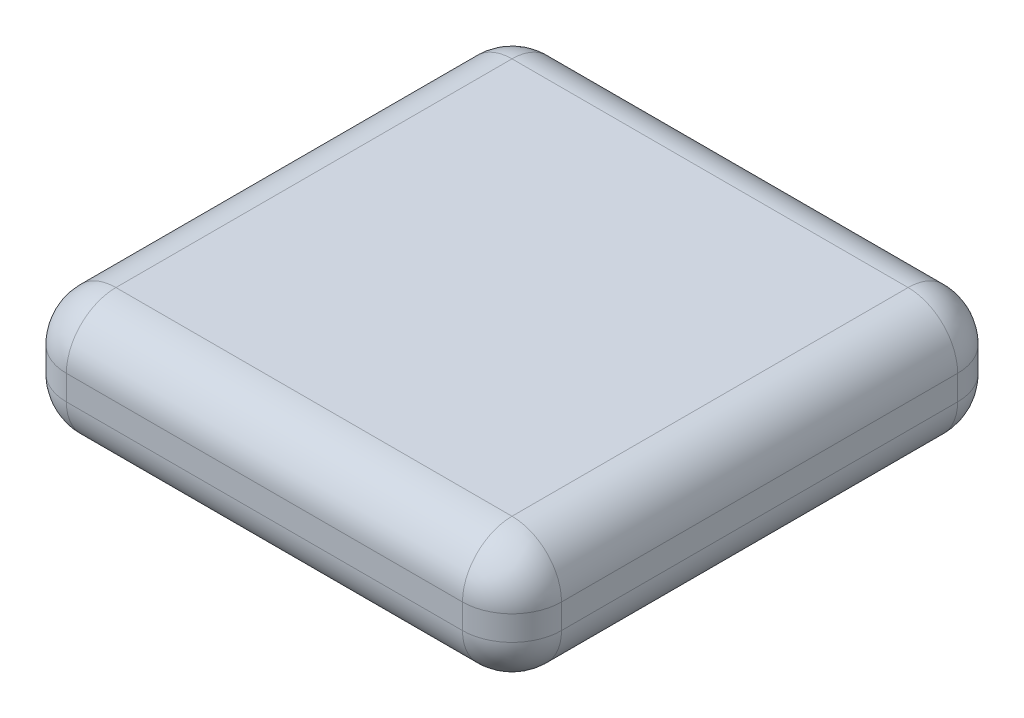
ISO-10303-21;
HEADER;
FILE_DESCRIPTION(('STEP AP214'),'2;1');
FILE_NAME('part.step','',(''),(''),'','','');
FILE_SCHEMA(('AUTOMOTIVE_DESIGN { 1 0 10303 214 1 1 1 1 }'));
ENDSEC;
DATA;
#1=APPLICATION_CONTEXT('core data for automotive mechanical design processes');
#2=APPLICATION_PROTOCOL_DEFINITION('international standard','automotive_design',2000,#1);
#3=PRODUCT_CONTEXT('',#1,'mechanical');
#4=PRODUCT('Part','Part','',(#3));
#5=PRODUCT_RELATED_PRODUCT_CATEGORY('part','',(#4));
#6=PRODUCT_DEFINITION_FORMATION('','',#4);
#7=PRODUCT_DEFINITION_CONTEXT('part definition',#1,'design');
#8=PRODUCT_DEFINITION('design','',#6,#7);
#9=PRODUCT_DEFINITION_SHAPE('','',#8);
#10=(LENGTH_UNIT() NAMED_UNIT(*) SI_UNIT(.MILLI.,.METRE.));
#11=(NAMED_UNIT(*) PLANE_ANGLE_UNIT() SI_UNIT($,.RADIAN.));
#12=(NAMED_UNIT(*) SI_UNIT($,.STERADIAN.) SOLID_ANGLE_UNIT());
#13=UNCERTAINTY_MEASURE_WITH_UNIT(LENGTH_MEASURE(1.E-05),#10,'distance_accuracy_value','');
#14=(GEOMETRIC_REPRESENTATION_CONTEXT(3) GLOBAL_UNCERTAINTY_ASSIGNED_CONTEXT((#13)) GLOBAL_UNIT_ASSIGNED_CONTEXT((#10,
#11,#12)) REPRESENTATION_CONTEXT('',''));
#15=CARTESIAN_POINT('',(0.,0.,0.));
#16=DIRECTION('',(0.,0.,1.));
#17=DIRECTION('',(1.,0.,0.));
#18=AXIS2_PLACEMENT_3D('',#15,#16,#17);
#19=CARTESIAN_POINT('',(100.,50.,-100.));
#20=DIRECTION('',(-1.,0.,0.));
#21=DIRECTION('',(0.,0.,1.));
#22=AXIS2_PLACEMENT_3D('',#19,#20,#21);
#23=PLANE('',#22);
#24=DIRECTION('',(0.,-1.,0.));
#25=VECTOR('',#24,1.);
#26=CARTESIAN_POINT('',(100.,50.,80.));
#27=LINE('',#26,#25);
#28=CARTESIAN_POINT('',(100.,30.,80.));
#29=VERTEX_POINT('',#28);
#30=CARTESIAN_POINT('',(100.,20.,80.));
#31=VERTEX_POINT('',#30);
#32=EDGE_CURVE('E178',#29,#31,#27,.T.);
#33=ORIENTED_EDGE('',*,*,#32,.T.);
#34=DIRECTION('',(0.,0.,-1.));
#35=VECTOR('',#34,1.);
#36=CARTESIAN_POINT('',(100.,20.,-100.));
#37=LINE('',#36,#35);
#38=CARTESIAN_POINT('',(100.,20.,-80.));
#39=VERTEX_POINT('',#38);
#40=EDGE_CURVE('E185',#31,#39,#37,.T.);
#41=ORIENTED_EDGE('',*,*,#40,.T.);
#42=DIRECTION('',(0.,-1.,0.));
#43=VECTOR('',#42,1.);
#44=CARTESIAN_POINT('',(100.,50.,-80.));
#45=LINE('',#44,#43);
#46=CARTESIAN_POINT('',(100.,30.,-80.));
#47=VERTEX_POINT('',#46);
#48=EDGE_CURVE('E181',#39,#47,#45,.F.);
#49=ORIENTED_EDGE('',*,*,#48,.T.);
#50=DIRECTION('',(0.,0.,-1.));
#51=VECTOR('',#50,1.);
#52=CARTESIAN_POINT('',(100.,30.,100.));
#53=LINE('',#52,#51);
#54=EDGE_CURVE('E175',#47,#29,#53,.F.);
#55=ORIENTED_EDGE('',*,*,#54,.T.);
#56=EDGE_LOOP('',(#33,#41,#49,#55));
#57=FACE_BOUND('',#56,.T.);
#58=ADVANCED_FACE('F39',(#57),#23,.F.);
#59=CARTESIAN_POINT('',(-100.,50.,-100.));
#60=DIRECTION('',(0.,0.,1.));
#61=DIRECTION('',(1.,0.,0.));
#62=AXIS2_PLACEMENT_3D('',#59,#60,#61);
#63=PLANE('',#62);
#64=DIRECTION('',(0.,-1.,0.));
#65=VECTOR('',#64,1.);
#66=CARTESIAN_POINT('',(80.,50.,-100.));
#67=LINE('',#66,#65);
#68=CARTESIAN_POINT('',(80.,30.,-100.));
#69=VERTEX_POINT('',#68);
#70=CARTESIAN_POINT('',(80.,20.,-100.));
#71=VERTEX_POINT('',#70);
#72=EDGE_CURVE('E142',#69,#71,#67,.T.);
#73=ORIENTED_EDGE('',*,*,#72,.T.);
#74=DIRECTION('',(-1.,0.,0.));
#75=VECTOR('',#74,1.);
#76=CARTESIAN_POINT('',(-100.,20.,-100.));
#77=LINE('',#76,#75);
#78=CARTESIAN_POINT('',(-80.,20.,-100.));
#79=VERTEX_POINT('',#78);
#80=EDGE_CURVE('E137',#71,#79,#77,.T.);
#81=ORIENTED_EDGE('',*,*,#80,.T.);
#82=DIRECTION('',(0.,-1.,0.));
#83=VECTOR('',#82,1.);
#84=CARTESIAN_POINT('',(-80.,50.,-100.));
#85=LINE('',#84,#83);
#86=CARTESIAN_POINT('',(-80.,30.,-100.));
#87=VERTEX_POINT('',#86);
#88=EDGE_CURVE('E130',#79,#87,#85,.F.);
#89=ORIENTED_EDGE('',*,*,#88,.T.);
#90=DIRECTION('',(-1.,0.,0.));
#91=VECTOR('',#90,1.);
#92=CARTESIAN_POINT('',(100.,30.,-100.));
#93=LINE('',#92,#91);
#94=EDGE_CURVE('E134',#87,#69,#93,.F.);
#95=ORIENTED_EDGE('',*,*,#94,.T.);
#96=EDGE_LOOP('',(#73,#81,#89,#95));
#97=FACE_BOUND('',#96,.T.);
#98=ADVANCED_FACE('F133',(#97),#63,.F.);
#99=CARTESIAN_POINT('',(-100.,50.,-100.));
#100=DIRECTION('',(1.,0.,0.));
#101=DIRECTION('',(0.,0.,-1.));
#102=AXIS2_PLACEMENT_3D('',#99,#100,#101);
#103=PLANE('',#102);
#104=DIRECTION('',(0.,0.,1.));
#105=VECTOR('',#104,1.);
#106=CARTESIAN_POINT('',(-100.,20.,-100.));
#107=LINE('',#106,#105);
#108=CARTESIAN_POINT('',(-100.,20.,-80.));
#109=VERTEX_POINT('',#108);
#110=CARTESIAN_POINT('',(-99.9999999999999,20.,80.));
#111=VERTEX_POINT('',#110);
#112=EDGE_CURVE('E206',#109,#111,#107,.T.);
#113=ORIENTED_EDGE('',*,*,#112,.T.);
#114=DIRECTION('',(0.,-1.,0.));
#115=VECTOR('',#114,1.);
#116=CARTESIAN_POINT('',(-99.9999999999999,50.,80.));
#117=LINE('',#116,#115);
#118=CARTESIAN_POINT('',(-99.9999999999999,30.,80.));
#119=VERTEX_POINT('',#118);
#120=EDGE_CURVE('E209',#111,#119,#117,.F.);
#121=ORIENTED_EDGE('',*,*,#120,.T.);
#122=DIRECTION('',(0.,0.,1.));
#123=VECTOR('',#122,1.);
#124=CARTESIAN_POINT('',(-100.,30.,-100.));
#125=LINE('',#124,#123);
#126=CARTESIAN_POINT('',(-100.,30.,-80.));
#127=VERTEX_POINT('',#126);
#128=EDGE_CURVE('E201',#119,#127,#125,.F.);
#129=ORIENTED_EDGE('',*,*,#128,.T.);
#130=DIRECTION('',(0.,-1.,0.));
#131=VECTOR('',#130,1.);
#132=CARTESIAN_POINT('',(-100.,50.,-80.));
#133=LINE('',#132,#131);
#134=EDGE_CURVE('E148',#127,#109,#133,.T.);
#135=ORIENTED_EDGE('',*,*,#134,.T.);
#136=EDGE_LOOP('',(#113,#121,#129,#135));
#137=FACE_BOUND('',#136,.T.);
#138=ADVANCED_FACE('F349',(#137),#103,.F.);
#139=CARTESIAN_POINT('',(-99.9999999999999,50.,100.));
#140=DIRECTION('',(0.,0.,-1.));
#141=DIRECTION('',(-1.,0.,0.));
#142=AXIS2_PLACEMENT_3D('',#139,#140,#141);
#143=PLANE('',#142);
#144=DIRECTION('',(0.,-1.,0.));
#145=VECTOR('',#144,1.);
#146=CARTESIAN_POINT('',(-79.9999999999999,50.,100.));
#147=LINE('',#146,#145);
#148=CARTESIAN_POINT('',(-79.9999999999999,30.,100.));
#149=VERTEX_POINT('',#148);
#150=CARTESIAN_POINT('',(-79.9999999999999,20.,100.));
#151=VERTEX_POINT('',#150);
#152=EDGE_CURVE('E191',#149,#151,#147,.T.);
#153=ORIENTED_EDGE('',*,*,#152,.T.);
#154=DIRECTION('',(1.,0.,0.));
#155=VECTOR('',#154,1.);
#156=CARTESIAN_POINT('',(-99.9999999999999,20.,100.));
#157=LINE('',#156,#155);
#158=CARTESIAN_POINT('',(80.,20.,100.));
#159=VERTEX_POINT('',#158);
#160=EDGE_CURVE('E198',#151,#159,#157,.T.);
#161=ORIENTED_EDGE('',*,*,#160,.T.);
#162=DIRECTION('',(0.,-1.,0.));
#163=VECTOR('',#162,1.);
#164=CARTESIAN_POINT('',(80.,50.,100.));
#165=LINE('',#164,#163);
#166=CARTESIAN_POINT('',(80.,30.,100.));
#167=VERTEX_POINT('',#166);
#168=EDGE_CURVE('E194',#159,#167,#165,.F.);
#169=ORIENTED_EDGE('',*,*,#168,.T.);
#170=DIRECTION('',(1.,0.,0.));
#171=VECTOR('',#170,1.);
#172=CARTESIAN_POINT('',(-99.9999999999999,30.,100.));
#173=LINE('',#172,#171);
#174=EDGE_CURVE('E188',#167,#149,#173,.F.);
#175=ORIENTED_EDGE('',*,*,#174,.T.);
#176=EDGE_LOOP('',(#153,#161,#169,#175));
#177=FACE_BOUND('',#176,.T.);
#178=ADVANCED_FACE('F327',(#177),#143,.F.);
#179=CARTESIAN_POINT('',(0.,50.,0.));
#180=DIRECTION('',(0.,1.,0.));
#181=DIRECTION('',(0.,0.,1.));
#182=AXIS2_PLACEMENT_3D('',#179,#180,#181);
#183=PLANE('',#182);
#184=DIRECTION('',(0.,0.,-1.));
#185=VECTOR('',#184,1.);
#186=CARTESIAN_POINT('',(80.,50.,-100.));
#187=LINE('',#186,#185);
#188=CARTESIAN_POINT('',(80.,50.,80.));
#189=VERTEX_POINT('',#188);
#190=CARTESIAN_POINT('',(80.,50.,-80.));
#191=VERTEX_POINT('',#190);
#192=EDGE_CURVE('E49',#189,#191,#187,.T.);
#193=ORIENTED_EDGE('',*,*,#192,.T.);
#194=DIRECTION('',(-1.,0.,0.));
#195=VECTOR('',#194,1.);
#196=CARTESIAN_POINT('',(-100.,50.,-80.));
#197=LINE('',#196,#195);
#198=CARTESIAN_POINT('',(-80.,50.,-80.));
#199=VERTEX_POINT('',#198);
#200=EDGE_CURVE('E11',#191,#199,#197,.T.);
#201=ORIENTED_EDGE('',*,*,#200,.T.);
#202=DIRECTION('',(0.,0.,1.));
#203=VECTOR('',#202,1.);
#204=CARTESIAN_POINT('',(-79.9999999999999,50.,100.));
#205=LINE('',#204,#203);
#206=CARTESIAN_POINT('',(-79.9999999999999,50.,80.));
#207=VERTEX_POINT('',#206);
#208=EDGE_CURVE('E229',#199,#207,#205,.T.);
#209=ORIENTED_EDGE('',*,*,#208,.T.);
#210=DIRECTION('',(1.,0.,0.));
#211=VECTOR('',#210,1.);
#212=CARTESIAN_POINT('',(100.,50.,80.));
#213=LINE('',#212,#211);
#214=EDGE_CURVE('E226',#207,#189,#213,.T.);
#215=ORIENTED_EDGE('',*,*,#214,.T.);
#216=EDGE_LOOP('',(#193,#201,#209,#215));
#217=FACE_BOUND('',#216,.T.);
#218=ADVANCED_FACE('F356',(#217),#183,.T.);
#219=CARTESIAN_POINT('',(0.,0.,0.));
#220=DIRECTION('',(0.,1.,0.));
#221=DIRECTION('',(0.,0.,1.));
#222=AXIS2_PLACEMENT_3D('',#219,#220,#221);
#223=PLANE('',#222);
#224=DIRECTION('',(1.,0.,0.));
#225=VECTOR('',#224,1.);
#226=CARTESIAN_POINT('',(0.,0.,80.));
#227=LINE('',#226,#225);
#228=CARTESIAN_POINT('',(80.,0.,80.));
#229=VERTEX_POINT('',#228);
#230=CARTESIAN_POINT('',(-79.9999999999999,0.,80.));
#231=VERTEX_POINT('',#230);
#232=EDGE_CURVE('E213',#229,#231,#227,.F.);
#233=ORIENTED_EDGE('',*,*,#232,.T.);
#234=DIRECTION('',(0.,0.,1.));
#235=VECTOR('',#234,1.);
#236=CARTESIAN_POINT('',(-80.,0.,0.));
#237=LINE('',#236,#235);
#238=CARTESIAN_POINT('',(-80.,0.,-80.));
#239=VERTEX_POINT('',#238);
#240=EDGE_CURVE('E222',#231,#239,#237,.F.);
#241=ORIENTED_EDGE('',*,*,#240,.T.);
#242=DIRECTION('',(-1.,0.,0.));
#243=VECTOR('',#242,1.);
#244=CARTESIAN_POINT('',(0.,0.,-80.));
#245=LINE('',#244,#243);
#246=CARTESIAN_POINT('',(80.,0.,-80.));
#247=VERTEX_POINT('',#246);
#248=EDGE_CURVE('E219',#239,#247,#245,.F.);
#249=ORIENTED_EDGE('',*,*,#248,.T.);
#250=DIRECTION('',(0.,0.,-1.));
#251=VECTOR('',#250,1.);
#252=CARTESIAN_POINT('',(80.,0.,0.));
#253=LINE('',#252,#251);
#254=EDGE_CURVE('E216',#247,#229,#253,.F.);
#255=ORIENTED_EDGE('',*,*,#254,.T.);
#256=EDGE_LOOP('',(#233,#241,#249,#255));
#257=FACE_BOUND('',#256,.T.);
#258=ADVANCED_FACE('F319',(#257),#223,.F.);
#259=CARTESIAN_POINT('',(-79.9999999999999,50.,80.));
#260=DIRECTION('',(0.,-1.,0.));
#261=DIRECTION('',(0.,0.,-1.));
#262=AXIS2_PLACEMENT_3D('',#259,#260,#261);
#263=CYLINDRICAL_SURFACE('',#262,20.);
#264=CARTESIAN_POINT('',(-79.9999999999999,30.,80.));
#265=DIRECTION('',(0.,1.,0.));
#266=DIRECTION('',(0.,0.,1.));
#267=AXIS2_PLACEMENT_3D('',#264,#265,#266);
#268=CIRCLE('',#267,20.);
#269=EDGE_CURVE('E43',#119,#149,#268,.T.);
#270=ORIENTED_EDGE('',*,*,#269,.F.);
#271=ORIENTED_EDGE('',*,*,#120,.F.);
#272=CARTESIAN_POINT('',(-79.9999999999999,20.,80.));
#273=DIRECTION('',(0.,-1.,0.));
#274=DIRECTION('',(0.,0.,-1.));
#275=AXIS2_PLACEMENT_3D('',#272,#273,#274);
#276=CIRCLE('',#275,20.);
#277=EDGE_CURVE('E169',#151,#111,#276,.T.);
#278=ORIENTED_EDGE('',*,*,#277,.F.);
#279=ORIENTED_EDGE('',*,*,#152,.F.);
#280=EDGE_LOOP('',(#270,#271,#278,#279));
#281=FACE_BOUND('',#280,.T.);
#282=ADVANCED_FACE('F41',(#281),#263,.T.);
#283=CARTESIAN_POINT('',(-79.9999999999999,30.,80.));
#284=DIRECTION('',(0.,0.,1.));
#285=DIRECTION('',(1.,0.,0.));
#286=AXIS2_PLACEMENT_3D('',#283,#284,#285);
#287=SPHERICAL_SURFACE('',#286,20.);
#288=CARTESIAN_POINT('',(-79.9999999999999,30.,80.));
#289=DIRECTION('',(0.,0.,1.));
#290=DIRECTION('',(1.,0.,0.));
#291=AXIS2_PLACEMENT_3D('',#288,#289,#290);
#292=CIRCLE('',#291,20.);
#293=EDGE_CURVE('E295',#119,#207,#292,.F.);
#294=ORIENTED_EDGE('',*,*,#293,.F.);
#295=ORIENTED_EDGE('',*,*,#269,.T.);
#296=CARTESIAN_POINT('',(-79.9999999999999,30.,80.));
#297=DIRECTION('',(-1.,0.,0.));
#298=DIRECTION('',(0.,-1.,0.));
#299=AXIS2_PLACEMENT_3D('',#296,#297,#298);
#300=CIRCLE('',#299,20.);
#301=EDGE_CURVE('E299',#207,#149,#300,.F.);
#302=ORIENTED_EDGE('',*,*,#301,.F.);
#303=EDGE_LOOP('',(#294,#295,#302));
#304=FACE_BOUND('',#303,.T.);
#305=ADVANCED_FACE('F345',(#304),#287,.T.);
#306=CARTESIAN_POINT('',(-79.9999999999999,20.,80.));
#307=DIRECTION('',(0.,0.,1.));
#308=DIRECTION('',(1.,0.,0.));
#309=AXIS2_PLACEMENT_3D('',#306,#307,#308);
#310=SPHERICAL_SURFACE('',#309,20.);
#311=CARTESIAN_POINT('',(-79.9999999999999,20.,80.));
#312=DIRECTION('',(-1.,0.,0.));
#313=DIRECTION('',(0.,0.,1.));
#314=AXIS2_PLACEMENT_3D('',#311,#312,#313);
#315=CIRCLE('',#314,20.);
#316=EDGE_CURVE('E287',#151,#231,#315,.F.);
#317=ORIENTED_EDGE('',*,*,#316,.F.);
#318=ORIENTED_EDGE('',*,*,#277,.T.);
#319=CARTESIAN_POINT('',(-79.9999999999999,20.,80.));
#320=DIRECTION('',(0.,0.,1.));
#321=DIRECTION('',(1.,0.,0.));
#322=AXIS2_PLACEMENT_3D('',#319,#320,#321);
#323=CIRCLE('',#322,20.);
#324=EDGE_CURVE('E291',#231,#111,#323,.F.);
#325=ORIENTED_EDGE('',*,*,#324,.F.);
#326=EDGE_LOOP('',(#317,#318,#325));
#327=FACE_BOUND('',#326,.T.);
#328=ADVANCED_FACE('F308',(#327),#310,.T.);
#329=CARTESIAN_POINT('',(0.,30.,80.));
#330=DIRECTION('',(-1.,0.,0.));
#331=DIRECTION('',(0.,0.,1.));
#332=AXIS2_PLACEMENT_3D('',#329,#330,#331);
#333=CYLINDRICAL_SURFACE('',#332,20.);
#334=ORIENTED_EDGE('',*,*,#301,.T.);
#335=ORIENTED_EDGE('',*,*,#174,.F.);
#336=CARTESIAN_POINT('',(80.,30.,80.));
#337=DIRECTION('',(1.,0.,0.));
#338=DIRECTION('',(0.,0.,-1.));
#339=AXIS2_PLACEMENT_3D('',#336,#337,#338);
#340=CIRCLE('',#339,20.);
#341=EDGE_CURVE('E280',#189,#167,#340,.T.);
#342=ORIENTED_EDGE('',*,*,#341,.F.);
#343=ORIENTED_EDGE('',*,*,#214,.F.);
#344=EDGE_LOOP('',(#334,#335,#342,#343));
#345=FACE_BOUND('',#344,.T.);
#346=ADVANCED_FACE('F339',(#345),#333,.T.);
#347=CARTESIAN_POINT('',(-80.,30.,0.));
#348=DIRECTION('',(0.,0.,-1.));
#349=DIRECTION('',(-1.,0.,0.));
#350=AXIS2_PLACEMENT_3D('',#347,#348,#349);
#351=CYLINDRICAL_SURFACE('',#350,20.);
#352=ORIENTED_EDGE('',*,*,#293,.T.);
#353=ORIENTED_EDGE('',*,*,#208,.F.);
#354=CARTESIAN_POINT('',(-80.,30.,-80.));
#355=DIRECTION('',(0.,0.,-1.));
#356=DIRECTION('',(-1.,0.,0.));
#357=AXIS2_PLACEMENT_3D('',#354,#355,#356);
#358=CIRCLE('',#357,20.);
#359=EDGE_CURVE('E152',#127,#199,#358,.T.);
#360=ORIENTED_EDGE('',*,*,#359,.F.);
#361=ORIENTED_EDGE('',*,*,#128,.F.);
#362=EDGE_LOOP('',(#352,#353,#360,#361));
#363=FACE_BOUND('',#362,.T.);
#364=ADVANCED_FACE('F347',(#363),#351,.T.);
#365=CARTESIAN_POINT('',(-80.,50.,-80.));
#366=DIRECTION('',(0.,-1.,0.));
#367=DIRECTION('',(0.,0.,-1.));
#368=AXIS2_PLACEMENT_3D('',#365,#366,#367);
#369=CYLINDRICAL_SURFACE('',#368,20.);
#370=CARTESIAN_POINT('',(-80.,20.,-80.));
#371=DIRECTION('',(0.,-1.,0.));
#372=DIRECTION('',(0.,0.,-1.));
#373=AXIS2_PLACEMENT_3D('',#370,#371,#372);
#374=CIRCLE('',#373,20.);
#375=EDGE_CURVE('E153',#109,#79,#374,.T.);
#376=ORIENTED_EDGE('',*,*,#375,.F.);
#377=ORIENTED_EDGE('',*,*,#134,.F.);
#378=CARTESIAN_POINT('',(-80.,30.,-80.));
#379=DIRECTION('',(0.,1.,0.));
#380=DIRECTION('',(0.,0.,1.));
#381=AXIS2_PLACEMENT_3D('',#378,#379,#380);
#382=CIRCLE('',#381,20.);
#383=EDGE_CURVE('E146',#87,#127,#382,.T.);
#384=ORIENTED_EDGE('',*,*,#383,.F.);
#385=ORIENTED_EDGE('',*,*,#88,.F.);
#386=EDGE_LOOP('',(#376,#377,#384,#385));
#387=FACE_BOUND('',#386,.T.);
#388=ADVANCED_FACE('F147',(#387),#369,.T.);
#389=CARTESIAN_POINT('',(-80.,20.,-100.));
#390=DIRECTION('',(0.,0.,1.));
#391=DIRECTION('',(1.,0.,0.));
#392=AXIS2_PLACEMENT_3D('',#389,#390,#391);
#393=CYLINDRICAL_SURFACE('',#392,20.);
#394=ORIENTED_EDGE('',*,*,#324,.T.);
#395=ORIENTED_EDGE('',*,*,#112,.F.);
#396=CARTESIAN_POINT('',(-80.,20.,-80.));
#397=DIRECTION('',(0.,0.,-1.));
#398=DIRECTION('',(-1.,0.,0.));
#399=AXIS2_PLACEMENT_3D('',#396,#397,#398);
#400=CIRCLE('',#399,20.);
#401=EDGE_CURVE('E272',#239,#109,#400,.T.);
#402=ORIENTED_EDGE('',*,*,#401,.F.);
#403=ORIENTED_EDGE('',*,*,#240,.F.);
#404=EDGE_LOOP('',(#394,#395,#402,#403));
#405=FACE_BOUND('',#404,.T.);
#406=ADVANCED_FACE('F316',(#405),#393,.T.);
#407=CARTESIAN_POINT('',(-99.9999999999999,20.,80.));
#408=DIRECTION('',(1.,0.,0.));
#409=DIRECTION('',(0.,0.,-1.));
#410=AXIS2_PLACEMENT_3D('',#407,#408,#409);
#411=CYLINDRICAL_SURFACE('',#410,20.);
#412=ORIENTED_EDGE('',*,*,#316,.T.);
#413=ORIENTED_EDGE('',*,*,#232,.F.);
#414=CARTESIAN_POINT('',(80.,20.,80.));
#415=DIRECTION('',(1.,0.,0.));
#416=DIRECTION('',(0.,0.,-1.));
#417=AXIS2_PLACEMENT_3D('',#414,#415,#416);
#418=CIRCLE('',#417,20.);
#419=EDGE_CURVE('E268',#159,#229,#418,.T.);
#420=ORIENTED_EDGE('',*,*,#419,.F.);
#421=ORIENTED_EDGE('',*,*,#160,.F.);
#422=EDGE_LOOP('',(#412,#413,#420,#421));
#423=FACE_BOUND('',#422,.T.);
#424=ADVANCED_FACE('F324',(#423),#411,.T.);
#425=CARTESIAN_POINT('',(80.,50.,80.));
#426=DIRECTION('',(0.,-1.,0.));
#427=DIRECTION('',(0.,0.,-1.));
#428=AXIS2_PLACEMENT_3D('',#425,#426,#427);
#429=CYLINDRICAL_SURFACE('',#428,20.);
#430=CARTESIAN_POINT('',(80.,30.,80.));
#431=DIRECTION('',(0.,1.,0.));
#432=DIRECTION('',(0.,0.,1.));
#433=AXIS2_PLACEMENT_3D('',#430,#431,#432);
#434=CIRCLE('',#433,20.);
#435=EDGE_CURVE('E283',#167,#29,#434,.T.);
#436=ORIENTED_EDGE('',*,*,#435,.F.);
#437=ORIENTED_EDGE('',*,*,#168,.F.);
#438=CARTESIAN_POINT('',(80.,20.,80.));
#439=DIRECTION('',(0.,-1.,0.));
#440=DIRECTION('',(0.,0.,-1.));
#441=AXIS2_PLACEMENT_3D('',#438,#439,#440);
#442=CIRCLE('',#441,20.);
#443=EDGE_CURVE('E264',#31,#159,#442,.T.);
#444=ORIENTED_EDGE('',*,*,#443,.F.);
#445=ORIENTED_EDGE('',*,*,#32,.F.);
#446=EDGE_LOOP('',(#436,#437,#444,#445));
#447=FACE_BOUND('',#446,.T.);
#448=ADVANCED_FACE('F331',(#447),#429,.T.);
#449=CARTESIAN_POINT('',(80.,30.,80.));
#450=DIRECTION('',(0.,0.,1.));
#451=DIRECTION('',(1.,0.,0.));
#452=AXIS2_PLACEMENT_3D('',#449,#450,#451);
#453=SPHERICAL_SURFACE('',#452,20.);
#454=ORIENTED_EDGE('',*,*,#341,.T.);
#455=ORIENTED_EDGE('',*,*,#435,.T.);
#456=CARTESIAN_POINT('',(80.,30.,80.));
#457=DIRECTION('',(0.,0.,1.));
#458=DIRECTION('',(1.,0.,0.));
#459=AXIS2_PLACEMENT_3D('',#456,#457,#458);
#460=CIRCLE('',#459,20.);
#461=EDGE_CURVE('E158',#189,#29,#460,.F.);
#462=ORIENTED_EDGE('',*,*,#461,.F.);
#463=EDGE_LOOP('',(#454,#455,#462));
#464=FACE_BOUND('',#463,.T.);
#465=ADVANCED_FACE('F401',(#464),#453,.T.);
#466=CARTESIAN_POINT('',(-80.,30.,-80.));
#467=DIRECTION('',(0.,0.,1.));
#468=DIRECTION('',(1.,0.,0.));
#469=AXIS2_PLACEMENT_3D('',#466,#467,#468);
#470=SPHERICAL_SURFACE('',#469,20.);
#471=ORIENTED_EDGE('',*,*,#383,.T.);
#472=ORIENTED_EDGE('',*,*,#359,.T.);
#473=CARTESIAN_POINT('',(-80.,30.,-80.));
#474=DIRECTION('',(-1.,0.,0.));
#475=DIRECTION('',(0.,0.,1.));
#476=AXIS2_PLACEMENT_3D('',#473,#474,#475);
#477=CIRCLE('',#476,20.);
#478=EDGE_CURVE('E62',#87,#199,#477,.F.);
#479=ORIENTED_EDGE('',*,*,#478,.F.);
#480=EDGE_LOOP('',(#471,#472,#479));
#481=FACE_BOUND('',#480,.T.);
#482=ADVANCED_FACE('F155',(#481),#470,.T.);
#483=CARTESIAN_POINT('',(-80.,20.,-80.));
#484=DIRECTION('',(0.,0.,1.));
#485=DIRECTION('',(1.,0.,0.));
#486=AXIS2_PLACEMENT_3D('',#483,#484,#485);
#487=SPHERICAL_SURFACE('',#486,20.);
#488=ORIENTED_EDGE('',*,*,#401,.T.);
#489=ORIENTED_EDGE('',*,*,#375,.T.);
#490=CARTESIAN_POINT('',(-80.,20.,-80.));
#491=DIRECTION('',(-1.,0.,0.));
#492=DIRECTION('',(0.,0.,1.));
#493=AXIS2_PLACEMENT_3D('',#490,#491,#492);
#494=CIRCLE('',#493,20.);
#495=EDGE_CURVE('E159',#239,#79,#494,.F.);
#496=ORIENTED_EDGE('',*,*,#495,.F.);
#497=EDGE_LOOP('',(#488,#489,#496));
#498=FACE_BOUND('',#497,.T.);
#499=ADVANCED_FACE('F394',(#498),#487,.T.);
#500=CARTESIAN_POINT('',(80.,20.,80.));
#501=DIRECTION('',(0.,0.,1.));
#502=DIRECTION('',(1.,0.,0.));
#503=AXIS2_PLACEMENT_3D('',#500,#501,#502);
#504=SPHERICAL_SURFACE('',#503,20.);
#505=ORIENTED_EDGE('',*,*,#443,.T.);
#506=ORIENTED_EDGE('',*,*,#419,.T.);
#507=CARTESIAN_POINT('',(80.,20.,80.));
#508=DIRECTION('',(0.,0.,1.));
#509=DIRECTION('',(1.,0.,0.));
#510=AXIS2_PLACEMENT_3D('',#507,#508,#509);
#511=CIRCLE('',#510,20.);
#512=EDGE_CURVE('E254',#31,#229,#511,.F.);
#513=ORIENTED_EDGE('',*,*,#512,.F.);
#514=EDGE_LOOP('',(#505,#506,#513));
#515=FACE_BOUND('',#514,.T.);
#516=ADVANCED_FACE('F390',(#515),#504,.T.);
#517=CARTESIAN_POINT('',(80.,30.,0.));
#518=DIRECTION('',(0.,0.,1.));
#519=DIRECTION('',(1.,0.,0.));
#520=AXIS2_PLACEMENT_3D('',#517,#518,#519);
#521=CYLINDRICAL_SURFACE('',#520,20.);
#522=ORIENTED_EDGE('',*,*,#461,.T.);
#523=ORIENTED_EDGE('',*,*,#54,.F.);
#524=CARTESIAN_POINT('',(80.,30.,-80.));
#525=DIRECTION('',(0.,0.,-1.));
#526=DIRECTION('',(-1.,0.,0.));
#527=AXIS2_PLACEMENT_3D('',#524,#525,#526);
#528=CIRCLE('',#527,20.);
#529=EDGE_CURVE('E250',#191,#47,#528,.T.);
#530=ORIENTED_EDGE('',*,*,#529,.F.);
#531=ORIENTED_EDGE('',*,*,#192,.F.);
#532=EDGE_LOOP('',(#522,#523,#530,#531));
#533=FACE_BOUND('',#532,.T.);
#534=ADVANCED_FACE('F387',(#533),#521,.T.);
#535=CARTESIAN_POINT('',(0.,30.,-80.));
#536=DIRECTION('',(1.,0.,0.));
#537=DIRECTION('',(0.,0.,-1.));
#538=AXIS2_PLACEMENT_3D('',#535,#536,#537);
#539=CYLINDRICAL_SURFACE('',#538,20.);
#540=ORIENTED_EDGE('',*,*,#478,.T.);
#541=ORIENTED_EDGE('',*,*,#200,.F.);
#542=CARTESIAN_POINT('',(80.,30.,-80.));
#543=DIRECTION('',(1.,0.,0.));
#544=DIRECTION('',(0.,1.,0.));
#545=AXIS2_PLACEMENT_3D('',#542,#543,#544);
#546=CIRCLE('',#545,20.);
#547=EDGE_CURVE('E163',#69,#191,#546,.T.);
#548=ORIENTED_EDGE('',*,*,#547,.F.);
#549=ORIENTED_EDGE('',*,*,#94,.F.);
#550=EDGE_LOOP('',(#540,#541,#548,#549));
#551=FACE_BOUND('',#550,.T.);
#552=ADVANCED_FACE('F161',(#551),#539,.T.);
#553=CARTESIAN_POINT('',(-100.,20.,-80.));
#554=DIRECTION('',(-1.,0.,0.));
#555=DIRECTION('',(0.,0.,1.));
#556=AXIS2_PLACEMENT_3D('',#553,#554,#555);
#557=CYLINDRICAL_SURFACE('',#556,20.);
#558=ORIENTED_EDGE('',*,*,#495,.T.);
#559=ORIENTED_EDGE('',*,*,#80,.F.);
#560=CARTESIAN_POINT('',(80.,20.,-80.));
#561=DIRECTION('',(1.,0.,0.));
#562=DIRECTION('',(0.,0.,-1.));
#563=AXIS2_PLACEMENT_3D('',#560,#561,#562);
#564=CIRCLE('',#563,20.);
#565=EDGE_CURVE('E244',#247,#71,#564,.T.);
#566=ORIENTED_EDGE('',*,*,#565,.F.);
#567=ORIENTED_EDGE('',*,*,#248,.F.);
#568=EDGE_LOOP('',(#558,#559,#566,#567));
#569=FACE_BOUND('',#568,.T.);
#570=ADVANCED_FACE('F380',(#569),#557,.T.);
#571=CARTESIAN_POINT('',(80.,20.,-100.));
#572=DIRECTION('',(0.,0.,-1.));
#573=DIRECTION('',(-1.,0.,0.));
#574=AXIS2_PLACEMENT_3D('',#571,#572,#573);
#575=CYLINDRICAL_SURFACE('',#574,20.);
#576=ORIENTED_EDGE('',*,*,#512,.T.);
#577=ORIENTED_EDGE('',*,*,#254,.F.);
#578=CARTESIAN_POINT('',(80.,20.,-80.));
#579=DIRECTION('',(0.,0.,-1.));
#580=DIRECTION('',(-1.,0.,0.));
#581=AXIS2_PLACEMENT_3D('',#578,#579,#580);
#582=CIRCLE('',#581,20.);
#583=EDGE_CURVE('E240',#39,#247,#582,.T.);
#584=ORIENTED_EDGE('',*,*,#583,.F.);
#585=ORIENTED_EDGE('',*,*,#40,.F.);
#586=EDGE_LOOP('',(#576,#577,#584,#585));
#587=FACE_BOUND('',#586,.T.);
#588=ADVANCED_FACE('F376',(#587),#575,.T.);
#589=CARTESIAN_POINT('',(80.,30.,-80.));
#590=DIRECTION('',(0.,0.,1.));
#591=DIRECTION('',(1.,0.,0.));
#592=AXIS2_PLACEMENT_3D('',#589,#590,#591);
#593=SPHERICAL_SURFACE('',#592,20.);
#594=ORIENTED_EDGE('',*,*,#547,.T.);
#595=ORIENTED_EDGE('',*,*,#529,.T.);
#596=CARTESIAN_POINT('',(80.,30.,-80.));
#597=DIRECTION('',(0.,1.,0.));
#598=DIRECTION('',(0.,0.,1.));
#599=AXIS2_PLACEMENT_3D('',#596,#597,#598);
#600=CIRCLE('',#599,20.);
#601=EDGE_CURVE('E237',#69,#47,#600,.F.);
#602=ORIENTED_EDGE('',*,*,#601,.F.);
#603=EDGE_LOOP('',(#594,#595,#602));
#604=FACE_BOUND('',#603,.T.);
#605=ADVANCED_FACE('F372',(#604),#593,.T.);
#606=CARTESIAN_POINT('',(80.,20.,-80.));
#607=DIRECTION('',(0.,0.,1.));
#608=DIRECTION('',(1.,0.,0.));
#609=AXIS2_PLACEMENT_3D('',#606,#607,#608);
#610=SPHERICAL_SURFACE('',#609,20.);
#611=ORIENTED_EDGE('',*,*,#583,.T.);
#612=ORIENTED_EDGE('',*,*,#565,.T.);
#613=CARTESIAN_POINT('',(80.,20.,-80.));
#614=DIRECTION('',(0.,-1.,0.));
#615=DIRECTION('',(0.,0.,-1.));
#616=AXIS2_PLACEMENT_3D('',#613,#614,#615);
#617=CIRCLE('',#616,20.);
#618=EDGE_CURVE('E234',#39,#71,#617,.F.);
#619=ORIENTED_EDGE('',*,*,#618,.F.);
#620=EDGE_LOOP('',(#611,#612,#619));
#621=FACE_BOUND('',#620,.T.);
#622=ADVANCED_FACE('F368',(#621),#610,.T.);
#623=CARTESIAN_POINT('',(80.,50.,-80.));
#624=DIRECTION('',(0.,-1.,0.));
#625=DIRECTION('',(0.,0.,-1.));
#626=AXIS2_PLACEMENT_3D('',#623,#624,#625);
#627=CYLINDRICAL_SURFACE('',#626,20.);
#628=ORIENTED_EDGE('',*,*,#601,.T.);
#629=ORIENTED_EDGE('',*,*,#48,.F.);
#630=ORIENTED_EDGE('',*,*,#618,.T.);
#631=ORIENTED_EDGE('',*,*,#72,.F.);
#632=EDGE_LOOP('',(#628,#629,#630,#631));
#633=FACE_BOUND('',#632,.T.);
#634=ADVANCED_FACE('F365',(#633),#627,.T.);
#635=CLOSED_SHELL('',(#58,#98,#138,#178,#218,#258,#282,#305,#328,#346,#364,#388,#406,#424,#448,
#465,#482,#499,#516,#534,#552,#570,#588,#605,#622,#634));
#636=MANIFOLD_SOLID_BREP('B2',#635);
#637=ADVANCED_BREP_SHAPE_REPRESENTATION('',(#18,#636),#14);
#638=SHAPE_DEFINITION_REPRESENTATION(#9,#637);
ENDSEC;
END-ISO-10303-21;
